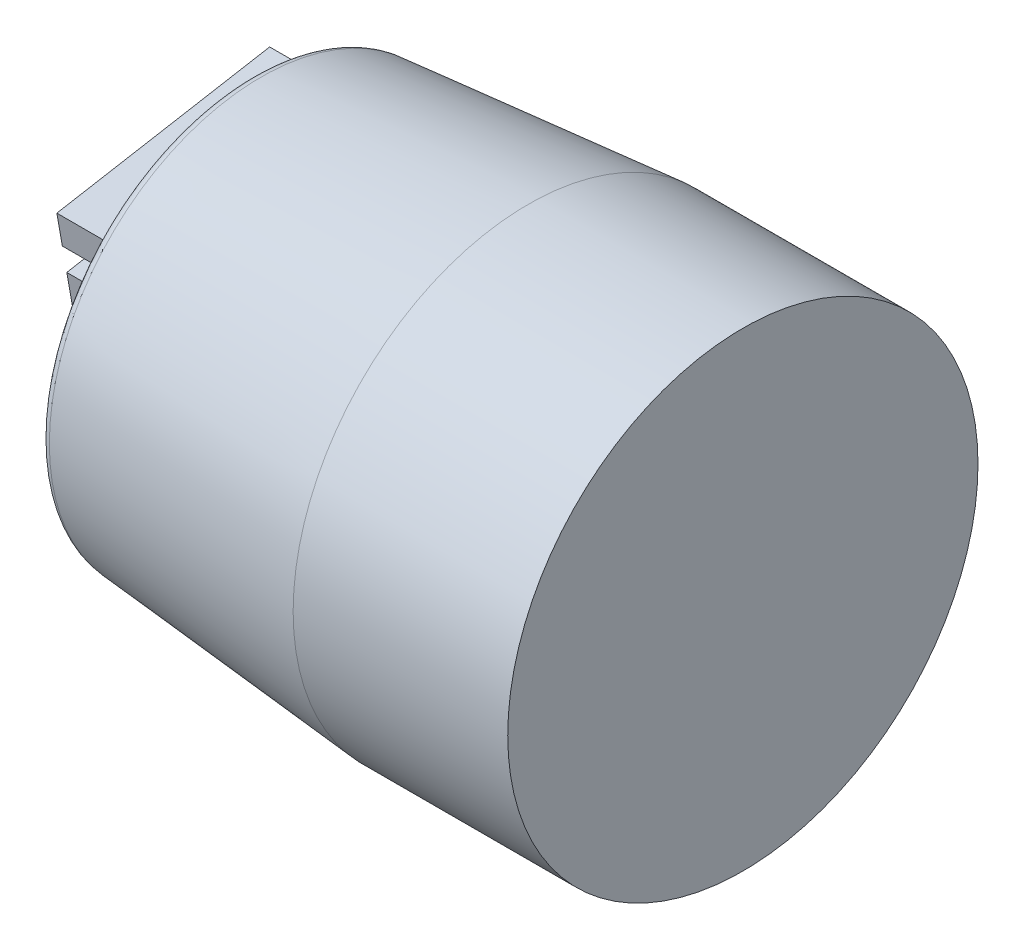
ISO-10303-21;
HEADER;
FILE_DESCRIPTION(('STEP AP214'),'2;1');
FILE_NAME('part.step','',(''),(''),'','','');
FILE_SCHEMA(('AUTOMOTIVE_DESIGN { 1 0 10303 214 1 1 1 1 }'));
ENDSEC;
DATA;
#1=APPLICATION_CONTEXT('core data for automotive mechanical design processes');
#2=APPLICATION_PROTOCOL_DEFINITION('international standard','automotive_design',2000,#1);
#3=PRODUCT_CONTEXT('',#1,'mechanical');
#4=PRODUCT('Part','Part','',(#3));
#5=PRODUCT_RELATED_PRODUCT_CATEGORY('part','',(#4));
#6=PRODUCT_DEFINITION_FORMATION('','',#4);
#7=PRODUCT_DEFINITION_CONTEXT('part definition',#1,'design');
#8=PRODUCT_DEFINITION('design','',#6,#7);
#9=PRODUCT_DEFINITION_SHAPE('','',#8);
#10=(LENGTH_UNIT() NAMED_UNIT(*) SI_UNIT(.MILLI.,.METRE.));
#11=(NAMED_UNIT(*) PLANE_ANGLE_UNIT() SI_UNIT($,.RADIAN.));
#12=(NAMED_UNIT(*) SI_UNIT($,.STERADIAN.) SOLID_ANGLE_UNIT());
#13=UNCERTAINTY_MEASURE_WITH_UNIT(LENGTH_MEASURE(1.E-05),#10,'distance_accuracy_value','');
#14=(GEOMETRIC_REPRESENTATION_CONTEXT(3) GLOBAL_UNCERTAINTY_ASSIGNED_CONTEXT((#13)) GLOBAL_UNIT_ASSIGNED_CONTEXT((#10,
#11,#12)) REPRESENTATION_CONTEXT('',''));
#15=CARTESIAN_POINT('',(0.,0.,0.));
#16=DIRECTION('',(0.,0.,1.));
#17=DIRECTION('',(1.,0.,0.));
#18=AXIS2_PLACEMENT_3D('',#15,#16,#17);
#19=CARTESIAN_POINT('',(-43.635,0.,0.));
#20=DIRECTION('',(1.,0.,0.));
#21=DIRECTION('',(0.,0.,-1.));
#22=AXIS2_PLACEMENT_3D('',#19,#20,#21);
#23=PLANE('',#22);
#24=DIRECTION('',(0.,-0.984807753012209,-0.173648177666924));
#25=VECTOR('',#24,1.);
#26=CARTESIAN_POINT('',(-43.635,12.6437294293273,-6.40169556586087));
#27=LINE('',#26,#25);
#28=CARTESIAN_POINT('',(-43.635,12.6437294293273,-6.40169556586087));
#29=VERTEX_POINT('',#28);
#30=CARTESIAN_POINT('',(-43.635,10.1817100467968,-6.83581601002818));
#31=VERTEX_POINT('',#30);
#32=EDGE_CURVE('E81',#29,#31,#27,.T.);
#33=ORIENTED_EDGE('',*,*,#32,.T.);
#34=DIRECTION('',(0.,-0.173648177666923,0.984807753012209));
#35=VECTOR('',#34,1.);
#36=CARTESIAN_POINT('',(-43.635,10.1817100467968,-6.83581601002818));
#37=LINE('',#36,#35);
#38=CARTESIAN_POINT('',(-43.635,7.22969102645908,9.90591579117939));
#39=VERTEX_POINT('',#38);
#40=EDGE_CURVE('E424',#31,#39,#37,.T.);
#41=ORIENTED_EDGE('',*,*,#40,.T.);
#42=DIRECTION('',(0.,0.98480775301221,0.173648177666922));
#43=VECTOR('',#42,1.);
#44=CARTESIAN_POINT('',(-43.635,9.69171040898961,10.3400362353467));
#45=LINE('',#44,#43);
#46=CARTESIAN_POINT('',(-43.635,9.69171040898961,10.3400362353467));
#47=VERTEX_POINT('',#46);
#48=EDGE_CURVE('E77',#39,#47,#45,.T.);
#49=ORIENTED_EDGE('',*,*,#48,.T.);
#50=DIRECTION('',(0.,0.173648177666923,-0.984807753012209));
#51=VECTOR('',#50,1.);
#52=CARTESIAN_POINT('',(-43.635,12.6437294293273,-6.40169556586087));
#53=LINE('',#52,#51);
#54=EDGE_CURVE('E79',#47,#29,#53,.T.);
#55=ORIENTED_EDGE('',*,*,#54,.T.);
#56=EDGE_LOOP('',(#33,#41,#49,#55));
#57=FACE_BOUND('',#56,.T.);
#58=ADVANCED_FACE('F16',(#57),#23,.F.);
#59=CARTESIAN_POINT('',(-43.635,0.,0.));
#60=DIRECTION('',(1.,0.,0.));
#61=DIRECTION('',(0.,0.,-1.));
#62=AXIS2_PLACEMENT_3D('',#59,#60,#61);
#63=PLANE('',#62);
#64=DIRECTION('',(0.,-0.984807753012209,-0.173648177666923));
#65=VECTOR('',#64,1.);
#66=CARTESIAN_POINT('',(-43.635,8.21209454077236,-7.18311236536203));
#67=LINE('',#66,#65);
#68=CARTESIAN_POINT('',(-43.635,8.21209454077236,-7.18311236536203));
#69=VERTEX_POINT('',#68);
#70=CARTESIAN_POINT('',(-43.635,5.75007515824184,-7.61723280952933));
#71=VERTEX_POINT('',#70);
#72=EDGE_CURVE('E389',#69,#71,#67,.T.);
#73=ORIENTED_EDGE('',*,*,#72,.T.);
#74=DIRECTION('',(0.,-0.173648177666923,0.984807753012209));
#75=VECTOR('',#74,1.);
#76=CARTESIAN_POINT('',(-43.635,5.75007515824184,-7.61723280952933));
#77=LINE('',#76,#75);
#78=CARTESIAN_POINT('',(-43.635,2.79805613790414,9.12449899167823));
#79=VERTEX_POINT('',#78);
#80=EDGE_CURVE('E392',#71,#79,#77,.T.);
#81=ORIENTED_EDGE('',*,*,#80,.T.);
#82=DIRECTION('',(0.,0.984807753012209,0.173648177666923));
#83=VECTOR('',#82,1.);
#84=CARTESIAN_POINT('',(-43.635,5.26007552043467,9.55861943584554));
#85=LINE('',#84,#83);
#86=CARTESIAN_POINT('',(-43.635,5.26007552043467,9.55861943584554));
#87=VERTEX_POINT('',#86);
#88=EDGE_CURVE('E417',#79,#87,#85,.T.);
#89=ORIENTED_EDGE('',*,*,#88,.T.);
#90=DIRECTION('',(0.,0.173648177666923,-0.984807753012209));
#91=VECTOR('',#90,1.);
#92=CARTESIAN_POINT('',(-43.635,8.21209454077236,-7.18311236536203));
#93=LINE('',#92,#91);
#94=EDGE_CURVE('E395',#87,#69,#93,.T.);
#95=ORIENTED_EDGE('',*,*,#94,.T.);
#96=EDGE_LOOP('',(#73,#81,#89,#95));
#97=FACE_BOUND('',#96,.T.);
#98=ADVANCED_FACE('F237',(#97),#63,.F.);
#99=CARTESIAN_POINT('',(-44.135,0.,0.));
#100=DIRECTION('',(1.,0.,0.));
#101=DIRECTION('',(0.,0.,-1.));
#102=AXIS2_PLACEMENT_3D('',#99,#100,#101);
#103=PLANE('',#102);
#104=DIRECTION('',(0.,0.,1.));
#105=VECTOR('',#104,1.);
#106=CARTESIAN_POINT('',(-44.135,-10.55,-1.2));
#107=LINE('',#106,#105);
#108=CARTESIAN_POINT('',(-44.135,-10.55,-1.2));
#109=VERTEX_POINT('',#108);
#110=CARTESIAN_POINT('',(-44.135,-10.55,8.8));
#111=VERTEX_POINT('',#110);
#112=EDGE_CURVE('E411',#109,#111,#107,.T.);
#113=ORIENTED_EDGE('',*,*,#112,.T.);
#114=DIRECTION('',(0.,1.,0.));
#115=VECTOR('',#114,1.);
#116=CARTESIAN_POINT('',(-44.135,-10.55,8.8));
#117=LINE('',#116,#115);
#118=CARTESIAN_POINT('',(-44.135,-8.55,8.8));
#119=VERTEX_POINT('',#118);
#120=EDGE_CURVE('E458',#111,#119,#117,.T.);
#121=ORIENTED_EDGE('',*,*,#120,.T.);
#122=DIRECTION('',(0.,0.,-1.));
#123=VECTOR('',#122,1.);
#124=CARTESIAN_POINT('',(-44.135,-8.55,-1.2));
#125=LINE('',#124,#123);
#126=CARTESIAN_POINT('',(-44.135,-8.55,-1.2));
#127=VERTEX_POINT('',#126);
#128=EDGE_CURVE('E456',#119,#127,#125,.T.);
#129=ORIENTED_EDGE('',*,*,#128,.T.);
#130=DIRECTION('',(0.,1.,0.));
#131=VECTOR('',#130,1.);
#132=CARTESIAN_POINT('',(-44.135,-10.55,-1.2));
#133=LINE('',#132,#131);
#134=EDGE_CURVE('E468',#127,#109,#133,.F.);
#135=ORIENTED_EDGE('',*,*,#134,.T.);
#136=EDGE_LOOP('',(#113,#121,#129,#135));
#137=FACE_BOUND('',#136,.T.);
#138=ADVANCED_FACE('F235',(#137),#103,.F.);
#139=CARTESIAN_POINT('',(-43.635,12.6437294293273,-6.40169556586087));
#140=DIRECTION('',(0.,-0.173648177666924,0.984807753012209));
#141=DIRECTION('',(0.,-0.984807753012209,-0.173648177666924));
#142=AXIS2_PLACEMENT_3D('',#139,#140,#141);
#143=PLANE('',#142);
#144=DIRECTION('',(1.,0.,0.));
#145=VECTOR('',#144,1.);
#146=CARTESIAN_POINT('',(-43.635,10.1817100467968,-6.83581601002818));
#147=LINE('',#146,#145);
#148=CARTESIAN_POINT('',(-38.635,10.1817100467968,-6.83581601002818));
#149=VERTEX_POINT('',#148);
#150=EDGE_CURVE('E96',#149,#31,#147,.F.);
#151=ORIENTED_EDGE('',*,*,#150,.T.);
#152=ORIENTED_EDGE('',*,*,#32,.F.);
#153=DIRECTION('',(1.,0.,0.));
#154=VECTOR('',#153,1.);
#155=CARTESIAN_POINT('',(-43.635,12.6437294293273,-6.40169556586087));
#156=LINE('',#155,#154);
#157=CARTESIAN_POINT('',(-38.635,12.6437294293273,-6.40169556586087));
#158=VERTEX_POINT('',#157);
#159=EDGE_CURVE('E87',#29,#158,#156,.T.);
#160=ORIENTED_EDGE('',*,*,#159,.T.);
#161=DIRECTION('',(0.,0.984807753012209,0.173648177666924));
#162=VECTOR('',#161,1.);
#163=CARTESIAN_POINT('',(-38.635,10.1817100467968,-6.83581601002818));
#164=LINE('',#163,#162);
#165=EDGE_CURVE('E153',#149,#158,#164,.T.);
#166=ORIENTED_EDGE('',*,*,#165,.F.);
#167=EDGE_LOOP('',(#151,#152,#160,#166));
#168=FACE_BOUND('',#167,.T.);
#169=ADVANCED_FACE('F91',(#168),#143,.F.);
#170=CARTESIAN_POINT('',(-43.635,12.6437294293273,-6.40169556586087));
#171=DIRECTION('',(0.,-0.984807753012209,-0.173648177666923));
#172=DIRECTION('',(0.,0.173648177666923,-0.984807753012209));
#173=AXIS2_PLACEMENT_3D('',#170,#171,#172);
#174=PLANE('',#173);
#175=ORIENTED_EDGE('',*,*,#159,.F.);
#176=ORIENTED_EDGE('',*,*,#54,.F.);
#177=DIRECTION('',(1.,0.,0.));
#178=VECTOR('',#177,1.);
#179=CARTESIAN_POINT('',(-43.635,9.69171040898961,10.3400362353467));
#180=LINE('',#179,#178);
#181=CARTESIAN_POINT('',(-38.635,9.69171040898961,10.3400362353467));
#182=VERTEX_POINT('',#181);
#183=EDGE_CURVE('E104',#47,#182,#180,.T.);
#184=ORIENTED_EDGE('',*,*,#183,.T.);
#185=DIRECTION('',(0.,-0.173648177666923,0.984807753012209));
#186=VECTOR('',#185,1.);
#187=CARTESIAN_POINT('',(-38.635,12.6437294293273,-6.40169556586087));
#188=LINE('',#187,#186);
#189=EDGE_CURVE('E101',#158,#182,#188,.T.);
#190=ORIENTED_EDGE('',*,*,#189,.F.);
#191=EDGE_LOOP('',(#175,#176,#184,#190));
#192=FACE_BOUND('',#191,.T.);
#193=ADVANCED_FACE('F99',(#192),#174,.F.);
#194=CARTESIAN_POINT('',(-43.635,9.69171040898961,10.3400362353467));
#195=DIRECTION('',(0.,0.173648177666922,-0.98480775301221));
#196=DIRECTION('',(0.,0.98480775301221,0.173648177666922));
#197=AXIS2_PLACEMENT_3D('',#194,#195,#196);
#198=PLANE('',#197);
#199=ORIENTED_EDGE('',*,*,#183,.F.);
#200=ORIENTED_EDGE('',*,*,#48,.F.);
#201=DIRECTION('',(1.,0.,0.));
#202=VECTOR('',#201,1.);
#203=CARTESIAN_POINT('',(-43.635,7.22969102645908,9.90591579117939));
#204=LINE('',#203,#202);
#205=CARTESIAN_POINT('',(-38.635,7.22969102645908,9.90591579117939));
#206=VERTEX_POINT('',#205);
#207=EDGE_CURVE('E398',#39,#206,#204,.T.);
#208=ORIENTED_EDGE('',*,*,#207,.T.);
#209=DIRECTION('',(0.,-0.98480775301221,-0.173648177666922));
#210=VECTOR('',#209,1.);
#211=CARTESIAN_POINT('',(-38.635,9.69171040898961,10.3400362353467));
#212=LINE('',#211,#210);
#213=EDGE_CURVE('E149',#182,#206,#212,.T.);
#214=ORIENTED_EDGE('',*,*,#213,.F.);
#215=EDGE_LOOP('',(#199,#200,#208,#214));
#216=FACE_BOUND('',#215,.T.);
#217=ADVANCED_FACE('F226',(#216),#198,.F.);
#218=CARTESIAN_POINT('',(-43.635,10.1817100467968,-6.83581601002818));
#219=DIRECTION('',(0.,0.984807753012209,0.173648177666923));
#220=DIRECTION('',(0.,-0.173648177666923,0.984807753012209));
#221=AXIS2_PLACEMENT_3D('',#218,#219,#220);
#222=PLANE('',#221);
#223=ORIENTED_EDGE('',*,*,#207,.F.);
#224=ORIENTED_EDGE('',*,*,#40,.F.);
#225=ORIENTED_EDGE('',*,*,#150,.F.);
#226=DIRECTION('',(0.,0.173648177666923,-0.984807753012209));
#227=VECTOR('',#226,1.);
#228=CARTESIAN_POINT('',(-38.635,7.22969102645908,9.90591579117939));
#229=LINE('',#228,#227);
#230=EDGE_CURVE('E146',#206,#149,#229,.T.);
#231=ORIENTED_EDGE('',*,*,#230,.F.);
#232=EDGE_LOOP('',(#223,#224,#225,#231));
#233=FACE_BOUND('',#232,.T.);
#234=ADVANCED_FACE('F222',(#233),#222,.F.);
#235=CARTESIAN_POINT('',(-43.635,8.21209454077236,-7.18311236536203));
#236=DIRECTION('',(0.,-0.173648177666923,0.984807753012209));
#237=DIRECTION('',(0.,-0.984807753012209,-0.173648177666923));
#238=AXIS2_PLACEMENT_3D('',#235,#236,#237);
#239=PLANE('',#238);
#240=DIRECTION('',(1.,0.,0.));
#241=VECTOR('',#240,1.);
#242=CARTESIAN_POINT('',(-43.635,5.75007515824184,-7.61723280952933));
#243=LINE('',#242,#241);
#244=CARTESIAN_POINT('',(-38.635,5.75007515824184,-7.61723280952933));
#245=VERTEX_POINT('',#244);
#246=EDGE_CURVE('E402',#245,#71,#243,.F.);
#247=ORIENTED_EDGE('',*,*,#246,.T.);
#248=ORIENTED_EDGE('',*,*,#72,.F.);
#249=DIRECTION('',(1.,0.,0.));
#250=VECTOR('',#249,1.);
#251=CARTESIAN_POINT('',(-43.635,8.21209454077236,-7.18311236536203));
#252=LINE('',#251,#250);
#253=CARTESIAN_POINT('',(-38.635,8.21209454077236,-7.18311236536203));
#254=VERTEX_POINT('',#253);
#255=EDGE_CURVE('E419',#69,#254,#252,.T.);
#256=ORIENTED_EDGE('',*,*,#255,.T.);
#257=DIRECTION('',(0.,0.984807753012209,0.173648177666923));
#258=VECTOR('',#257,1.);
#259=CARTESIAN_POINT('',(-38.635,5.75007515824184,-7.61723280952933));
#260=LINE('',#259,#258);
#261=EDGE_CURVE('E143',#245,#254,#260,.T.);
#262=ORIENTED_EDGE('',*,*,#261,.F.);
#263=EDGE_LOOP('',(#247,#248,#256,#262));
#264=FACE_BOUND('',#263,.T.);
#265=ADVANCED_FACE('F218',(#264),#239,.F.);
#266=CARTESIAN_POINT('',(-43.635,8.21209454077236,-7.18311236536203));
#267=DIRECTION('',(0.,-0.984807753012209,-0.173648177666923));
#268=DIRECTION('',(0.,0.173648177666923,-0.984807753012209));
#269=AXIS2_PLACEMENT_3D('',#266,#267,#268);
#270=PLANE('',#269);
#271=ORIENTED_EDGE('',*,*,#255,.F.);
#272=ORIENTED_EDGE('',*,*,#94,.F.);
#273=DIRECTION('',(1.,0.,0.));
#274=VECTOR('',#273,1.);
#275=CARTESIAN_POINT('',(-43.635,5.26007552043467,9.55861943584554));
#276=LINE('',#275,#274);
#277=CARTESIAN_POINT('',(-38.635,5.26007552043467,9.55861943584554));
#278=VERTEX_POINT('',#277);
#279=EDGE_CURVE('E405',#87,#278,#276,.T.);
#280=ORIENTED_EDGE('',*,*,#279,.T.);
#281=DIRECTION('',(0.,-0.173648177666923,0.984807753012209));
#282=VECTOR('',#281,1.);
#283=CARTESIAN_POINT('',(-38.635,8.21209454077236,-7.18311236536203));
#284=LINE('',#283,#282);
#285=EDGE_CURVE('E140',#254,#278,#284,.T.);
#286=ORIENTED_EDGE('',*,*,#285,.F.);
#287=EDGE_LOOP('',(#271,#272,#280,#286));
#288=FACE_BOUND('',#287,.T.);
#289=ADVANCED_FACE('F214',(#288),#270,.F.);
#290=CARTESIAN_POINT('',(-43.635,5.26007552043467,9.55861943584554));
#291=DIRECTION('',(0.,0.173648177666923,-0.984807753012209));
#292=DIRECTION('',(0.,0.984807753012209,0.173648177666923));
#293=AXIS2_PLACEMENT_3D('',#290,#291,#292);
#294=PLANE('',#293);
#295=ORIENTED_EDGE('',*,*,#279,.F.);
#296=ORIENTED_EDGE('',*,*,#88,.F.);
#297=DIRECTION('',(1.,0.,0.));
#298=VECTOR('',#297,1.);
#299=CARTESIAN_POINT('',(-43.635,2.79805613790414,9.12449899167823));
#300=LINE('',#299,#298);
#301=CARTESIAN_POINT('',(-38.635,2.79805613790414,9.12449899167823));
#302=VERTEX_POINT('',#301);
#303=EDGE_CURVE('E409',#79,#302,#300,.T.);
#304=ORIENTED_EDGE('',*,*,#303,.T.);
#305=DIRECTION('',(0.,-0.984807753012209,-0.173648177666923));
#306=VECTOR('',#305,1.);
#307=CARTESIAN_POINT('',(-38.635,5.26007552043467,9.55861943584554));
#308=LINE('',#307,#306);
#309=EDGE_CURVE('E137',#278,#302,#308,.T.);
#310=ORIENTED_EDGE('',*,*,#309,.F.);
#311=EDGE_LOOP('',(#295,#296,#304,#310));
#312=FACE_BOUND('',#311,.T.);
#313=ADVANCED_FACE('F210',(#312),#294,.F.);
#314=CARTESIAN_POINT('',(-43.635,5.75007515824184,-7.61723280952933));
#315=DIRECTION('',(0.,0.984807753012209,0.173648177666923));
#316=DIRECTION('',(0.,-0.173648177666923,0.984807753012209));
#317=AXIS2_PLACEMENT_3D('',#314,#315,#316);
#318=PLANE('',#317);
#319=ORIENTED_EDGE('',*,*,#303,.F.);
#320=ORIENTED_EDGE('',*,*,#80,.F.);
#321=ORIENTED_EDGE('',*,*,#246,.F.);
#322=DIRECTION('',(0.,0.173648177666923,-0.984807753012209));
#323=VECTOR('',#322,1.);
#324=CARTESIAN_POINT('',(-38.635,2.79805613790414,9.12449899167823));
#325=LINE('',#324,#323);
#326=EDGE_CURVE('E134',#302,#245,#325,.T.);
#327=ORIENTED_EDGE('',*,*,#326,.F.);
#328=EDGE_LOOP('',(#319,#320,#321,#327));
#329=FACE_BOUND('',#328,.T.);
#330=ADVANCED_FACE('F206',(#329),#318,.F.);
#331=CARTESIAN_POINT('',(-44.135,-10.55,-1.2));
#332=DIRECTION('',(0.,1.,0.));
#333=DIRECTION('',(0.,0.,1.));
#334=AXIS2_PLACEMENT_3D('',#331,#332,#333);
#335=PLANE('',#334);
#336=DIRECTION('',(-1.,0.,0.));
#337=VECTOR('',#336,1.);
#338=CARTESIAN_POINT('',(-44.135,-10.55,8.8));
#339=LINE('',#338,#337);
#340=CARTESIAN_POINT('',(-38.635,-10.55,8.8));
#341=VERTEX_POINT('',#340);
#342=EDGE_CURVE('E461',#341,#111,#339,.T.);
#343=ORIENTED_EDGE('',*,*,#342,.T.);
#344=ORIENTED_EDGE('',*,*,#112,.F.);
#345=DIRECTION('',(1.,0.,0.));
#346=VECTOR('',#345,1.);
#347=CARTESIAN_POINT('',(-44.135,-10.55,-1.2));
#348=LINE('',#347,#346);
#349=CARTESIAN_POINT('',(-38.635,-10.55,-1.2));
#350=VERTEX_POINT('',#349);
#351=EDGE_CURVE('E466',#109,#350,#348,.T.);
#352=ORIENTED_EDGE('',*,*,#351,.T.);
#353=DIRECTION('',(0.,0.,1.));
#354=VECTOR('',#353,1.);
#355=CARTESIAN_POINT('',(-38.635,-10.55,0.));
#356=LINE('',#355,#354);
#357=EDGE_CURVE('E132',#341,#350,#356,.F.);
#358=ORIENTED_EDGE('',*,*,#357,.F.);
#359=EDGE_LOOP('',(#343,#344,#352,#358));
#360=FACE_BOUND('',#359,.T.);
#361=ADVANCED_FACE('F202',(#360),#335,.F.);
#362=CARTESIAN_POINT('',(-44.135,-10.55,-1.2));
#363=DIRECTION('',(0.,0.,1.));
#364=DIRECTION('',(1.,0.,0.));
#365=AXIS2_PLACEMENT_3D('',#362,#363,#364);
#366=PLANE('',#365);
#367=ORIENTED_EDGE('',*,*,#351,.F.);
#368=ORIENTED_EDGE('',*,*,#134,.F.);
#369=DIRECTION('',(1.,0.,0.));
#370=VECTOR('',#369,1.);
#371=CARTESIAN_POINT('',(-44.135,-8.55,-1.2));
#372=LINE('',#371,#370);
#373=CARTESIAN_POINT('',(-38.635,-8.55,-1.2));
#374=VERTEX_POINT('',#373);
#375=EDGE_CURVE('E467',#127,#374,#372,.T.);
#376=ORIENTED_EDGE('',*,*,#375,.T.);
#377=DIRECTION('',(0.,1.,0.));
#378=VECTOR('',#377,1.);
#379=CARTESIAN_POINT('',(-38.635,15.8639691404337,-1.2));
#380=LINE('',#379,#378);
#381=EDGE_CURVE('E123',#350,#374,#380,.T.);
#382=ORIENTED_EDGE('',*,*,#381,.F.);
#383=EDGE_LOOP('',(#367,#368,#376,#382));
#384=FACE_BOUND('',#383,.T.);
#385=ADVANCED_FACE('F198',(#384),#366,.F.);
#386=CARTESIAN_POINT('',(-44.135,-8.55,-1.2));
#387=DIRECTION('',(0.,-1.,0.));
#388=DIRECTION('',(0.,0.,-1.));
#389=AXIS2_PLACEMENT_3D('',#386,#387,#388);
#390=PLANE('',#389);
#391=ORIENTED_EDGE('',*,*,#375,.F.);
#392=ORIENTED_EDGE('',*,*,#128,.F.);
#393=DIRECTION('',(-1.,0.,0.));
#394=VECTOR('',#393,1.);
#395=CARTESIAN_POINT('',(-44.135,-8.55,8.8));
#396=LINE('',#395,#394);
#397=CARTESIAN_POINT('',(-38.635,-8.55,8.8));
#398=VERTEX_POINT('',#397);
#399=EDGE_CURVE('E154',#119,#398,#396,.F.);
#400=ORIENTED_EDGE('',*,*,#399,.T.);
#401=DIRECTION('',(0.,0.,1.));
#402=VECTOR('',#401,1.);
#403=CARTESIAN_POINT('',(-38.635,-8.55,0.));
#404=LINE('',#403,#402);
#405=EDGE_CURVE('E116',#374,#398,#404,.T.);
#406=ORIENTED_EDGE('',*,*,#405,.F.);
#407=EDGE_LOOP('',(#391,#392,#400,#406));
#408=FACE_BOUND('',#407,.T.);
#409=ADVANCED_FACE('F194',(#408),#390,.F.);
#410=CARTESIAN_POINT('',(-44.135,-10.55,8.8));
#411=DIRECTION('',(0.,0.,-1.));
#412=DIRECTION('',(-1.,0.,0.));
#413=AXIS2_PLACEMENT_3D('',#410,#411,#412);
#414=PLANE('',#413);
#415=ORIENTED_EDGE('',*,*,#399,.F.);
#416=ORIENTED_EDGE('',*,*,#120,.F.);
#417=ORIENTED_EDGE('',*,*,#342,.F.);
#418=DIRECTION('',(0.,1.,0.));
#419=VECTOR('',#418,1.);
#420=CARTESIAN_POINT('',(-38.635,15.8639691404337,8.8));
#421=LINE('',#420,#419);
#422=EDGE_CURVE('E114',#398,#341,#421,.F.);
#423=ORIENTED_EDGE('',*,*,#422,.F.);
#424=EDGE_LOOP('',(#415,#416,#417,#423));
#425=FACE_BOUND('',#424,.T.);
#426=ADVANCED_FACE('F190',(#425),#414,.F.);
#427=CARTESIAN_POINT('',(-38.635,15.8639691404337,0.));
#428=DIRECTION('',(-1.,0.,0.));
#429=DIRECTION('',(0.,0.,1.));
#430=AXIS2_PLACEMENT_3D('',#427,#428,#429);
#431=PLANE('',#430);
#432=ORIENTED_EDGE('',*,*,#405,.T.);
#433=ORIENTED_EDGE('',*,*,#422,.T.);
#434=ORIENTED_EDGE('',*,*,#357,.T.);
#435=ORIENTED_EDGE('',*,*,#381,.T.);
#436=EDGE_LOOP('',(#432,#433,#434,#435));
#437=FACE_BOUND('',#436,.T.);
#438=ORIENTED_EDGE('',*,*,#309,.T.);
#439=ORIENTED_EDGE('',*,*,#326,.T.);
#440=ORIENTED_EDGE('',*,*,#261,.T.);
#441=ORIENTED_EDGE('',*,*,#285,.T.);
#442=EDGE_LOOP('',(#438,#439,#440,#441));
#443=FACE_BOUND('',#442,.T.);
#444=CARTESIAN_POINT('',(-38.635,0.,0.));
#445=DIRECTION('',(1.,0.,0.));
#446=DIRECTION('',(0.,0.,-1.));
#447=AXIS2_PLACEMENT_3D('',#444,#445,#446);
#448=CIRCLE('',#447,15.8639691404337);
#449=CARTESIAN_POINT('',(-38.635,0.,-15.8639691404337));
#450=VERTEX_POINT('',#449);
#451=CARTESIAN_POINT('',(-38.635,0.,15.8639691404337));
#452=VERTEX_POINT('',#451);
#453=EDGE_CURVE('E110',#450,#452,#448,.T.);
#454=ORIENTED_EDGE('',*,*,#453,.F.);
#455=CARTESIAN_POINT('',(-38.635,0.,0.));
#456=DIRECTION('',(1.,0.,0.));
#457=DIRECTION('',(0.,0.,1.));
#458=AXIS2_PLACEMENT_3D('',#455,#456,#457);
#459=CIRCLE('',#458,15.8639691404337);
#460=EDGE_CURVE('E35',#452,#450,#459,.T.);
#461=ORIENTED_EDGE('',*,*,#460,.F.);
#462=EDGE_LOOP('',(#454,#461));
#463=FACE_BOUND('',#462,.T.);
#464=ORIENTED_EDGE('',*,*,#213,.T.);
#465=ORIENTED_EDGE('',*,*,#230,.T.);
#466=ORIENTED_EDGE('',*,*,#165,.T.);
#467=ORIENTED_EDGE('',*,*,#189,.T.);
#468=EDGE_LOOP('',(#464,#465,#466,#467));
#469=FACE_BOUND('',#468,.T.);
#470=ADVANCED_FACE('F181',(#437,#443,#463,#469),#431,.T.);
#471=CARTESIAN_POINT('',(0.,0.,0.));
#472=DIRECTION('',(1.,0.,0.));
#473=DIRECTION('',(0.,0.,-1.));
#474=AXIS2_PLACEMENT_3D('',#471,#472,#473);
#475=PLANE('',#474);
#476=CARTESIAN_POINT('',(0.,0.,0.));
#477=DIRECTION('',(1.,0.,0.));
#478=DIRECTION('',(0.,0.,-1.));
#479=AXIS2_PLACEMENT_3D('',#476,#477,#478);
#480=CIRCLE('',#479,18.5);
#481=CARTESIAN_POINT('',(0.,0.,-18.5));
#482=VERTEX_POINT('',#481);
#483=EDGE_CURVE('E108',#482,#482,#480,.F.);
#484=ORIENTED_EDGE('',*,*,#483,.F.);
#485=EDGE_LOOP('',(#484));
#486=FACE_BOUND('',#485,.T.);
#487=ADVANCED_FACE('F171',(#486),#475,.T.);
#488=CARTESIAN_POINT('',(-37.835,0.,0.));
#489=DIRECTION('',(1.,0.,0.));
#490=DIRECTION('',(0.,0.,-1.));
#491=AXIS2_PLACEMENT_3D('',#488,#489,#490);
#492=TOROIDAL_SURFACE('',#491,15.8639691404337,0.800000000000001);
#493=CARTESIAN_POINT('',(-37.9047245941981,0.,0.));
#494=DIRECTION('',(1.,0.,0.));
#495=DIRECTION('',(0.,0.,-1.));
#496=AXIS2_PLACEMENT_3D('',#493,#494,#495);
#497=CIRCLE('',#496,16.6609248989071);
#498=CARTESIAN_POINT('',(-37.9047245941981,0.,-16.6609248989071));
#499=VERTEX_POINT('',#498);
#500=EDGE_CURVE('E27',#499,#499,#497,.T.);
#501=ORIENTED_EDGE('',*,*,#500,.F.);
#502=EDGE_LOOP('',(#501));
#503=FACE_BOUND('',#502,.T.);
#504=ORIENTED_EDGE('',*,*,#453,.T.);
#505=ORIENTED_EDGE('',*,*,#460,.T.);
#506=EDGE_LOOP('',(#504,#505));
#507=FACE_BOUND('',#506,.T.);
#508=ADVANCED_FACE('F112',(#503,#507),#492,.T.);
#509=CARTESIAN_POINT('',(0.,0.,0.));
#510=DIRECTION('',(1.,0.,0.));
#511=DIRECTION('',(0.,0.,-1.));
#512=AXIS2_PLACEMENT_3D('',#509,#510,#511);
#513=CYLINDRICAL_SURFACE('',#512,18.5);
#514=ORIENTED_EDGE('',*,*,#483,.T.);
#515=EDGE_LOOP('',(#514));
#516=FACE_BOUND('',#515,.T.);
#517=CARTESIAN_POINT('',(-16.884,0.,0.));
#518=DIRECTION('',(1.,0.,0.));
#519=DIRECTION('',(0.,0.,-1.));
#520=AXIS2_PLACEMENT_3D('',#517,#518,#519);
#521=CIRCLE('',#520,18.5);
#522=CARTESIAN_POINT('',(-16.884,0.,-18.5));
#523=VERTEX_POINT('',#522);
#524=EDGE_CURVE('E11',#523,#523,#521,.F.);
#525=ORIENTED_EDGE('',*,*,#524,.F.);
#526=EDGE_LOOP('',(#525));
#527=FACE_BOUND('',#526,.T.);
#528=ADVANCED_FACE('F170',(#516,#527),#513,.T.);
#529=CARTESIAN_POINT('',(-16.884,0.,0.));
#530=DIRECTION('',(1.,0.,0.));
#531=DIRECTION('',(0.,0.,-1.));
#532=AXIS2_PLACEMENT_3D('',#529,#530,#531);
#533=CONICAL_SURFACE('',#532,18.5,0.0872664625997167);
#534=ORIENTED_EDGE('',*,*,#524,.T.);
#535=EDGE_LOOP('',(#534));
#536=FACE_BOUND('',#535,.T.);
#537=ORIENTED_EDGE('',*,*,#500,.T.);
#538=EDGE_LOOP('',(#537));
#539=FACE_BOUND('',#538,.T.);
#540=ADVANCED_FACE('F245',(#536,#539),#533,.T.);
#541=CLOSED_SHELL('',(#58,#98,#138,#169,#193,#217,#234,#265,#289,#313,#330,#361,#385,#409,#426,
#470,#487,#508,#528,#540));
#542=MANIFOLD_SOLID_BREP('B1',#541);
#543=ADVANCED_BREP_SHAPE_REPRESENTATION('',(#18,#542),#14);
#544=SHAPE_DEFINITION_REPRESENTATION(#9,#543);
ENDSEC;
END-ISO-10303-21;
